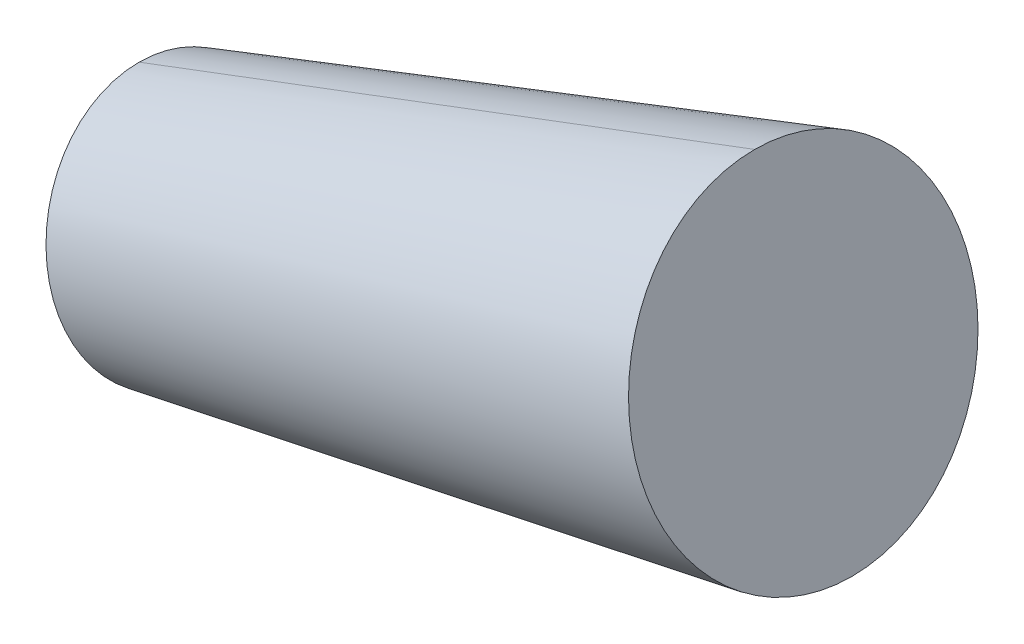
ISO-10303-21;
HEADER;
FILE_DESCRIPTION(('STEP AP214'),'2;1');
FILE_NAME('part.step','',(''),(''),'','','');
FILE_SCHEMA(('AUTOMOTIVE_DESIGN { 1 0 10303 214 1 1 1 1 }'));
ENDSEC;
DATA;
#1=APPLICATION_CONTEXT('core data for automotive mechanical design processes');
#2=APPLICATION_PROTOCOL_DEFINITION('international standard','automotive_design',2000,#1);
#3=PRODUCT_CONTEXT('',#1,'mechanical');
#4=PRODUCT('Part','Part','',(#3));
#5=PRODUCT_RELATED_PRODUCT_CATEGORY('part','',(#4));
#6=PRODUCT_DEFINITION_FORMATION('','',#4);
#7=PRODUCT_DEFINITION_CONTEXT('part definition',#1,'design');
#8=PRODUCT_DEFINITION('design','',#6,#7);
#9=PRODUCT_DEFINITION_SHAPE('','',#8);
#10=(LENGTH_UNIT() NAMED_UNIT(*) SI_UNIT(.MILLI.,.METRE.));
#11=(NAMED_UNIT(*) PLANE_ANGLE_UNIT() SI_UNIT($,.RADIAN.));
#12=(NAMED_UNIT(*) SI_UNIT($,.STERADIAN.) SOLID_ANGLE_UNIT());
#13=UNCERTAINTY_MEASURE_WITH_UNIT(LENGTH_MEASURE(1.E-05),#10,'distance_accuracy_value','');
#14=(GEOMETRIC_REPRESENTATION_CONTEXT(3) GLOBAL_UNCERTAINTY_ASSIGNED_CONTEXT((#13)) GLOBAL_UNIT_ASSIGNED_CONTEXT((#10,
#11,#12)) REPRESENTATION_CONTEXT('',''));
#15=CARTESIAN_POINT('',(0.,0.,0.));
#16=DIRECTION('',(0.,0.,1.));
#17=DIRECTION('',(1.,0.,0.));
#18=AXIS2_PLACEMENT_3D('',#15,#16,#17);
#19=CARTESIAN_POINT('',(13.8143463673463,26.1742486277882,0.));
#20=DIRECTION('',(0.957152868391763,0.289583125422429,0.));
#21=DIRECTION('',(0.,0.,-1.00000000000001));
#22=AXIS2_PLACEMENT_3D('',#19,#20,#21);
#23=CONICAL_SURFACE('',#22,3.375,0.0668984702);
#24=CARTESIAN_POINT('',(1.1799285045748,22.3517513722121,0.));
#25=DIRECTION('',(-0.957152868391762,-0.289583125422429,0.));
#26=DIRECTION('',(0.289583125422428,-0.957152868391767,0.));
#27=AXIS2_PLACEMENT_3D('',#24,#25,#26);
#28=CIRCLE('',#27,2.4906204802);
#29=CARTESIAN_POINT('',(1.9011701674844,19.9678468354731,0.));
#30=VERTEX_POINT('',#29);
#31=CARTESIAN_POINT('',(0.458686841527417,24.7356559093083,0.));
#32=VERTEX_POINT('',#31);
#33=EDGE_CURVE('E13',#30,#32,#28,.T.);
#34=ORIENTED_EDGE('',*,*,#33,.F.);
#35=DIRECTION('',(0.974370064778719,0.22495105437209,0.));
#36=VECTOR('',#35,1.);
#37=CARTESIAN_POINT('',(1.90117016756777,19.9678468350994,0.));
#38=LINE('',#37,#36);
#39=CARTESIAN_POINT('',(14.791689415647,22.9438576969661,0.));
#40=VERTEX_POINT('',#39);
#41=EDGE_CURVE('E33',#30,#40,#38,.T.);
#42=ORIENTED_EDGE('',*,*,#41,.T.);
#43=CARTESIAN_POINT('',(13.8143463673463,26.1742486277882,0.));
#44=DIRECTION('',(-0.957152868391763,-0.289583125422429,0.));
#45=DIRECTION('',(0.289583125422428,-0.957152868391766,0.));
#46=AXIS2_PLACEMENT_3D('',#43,#44,#45);
#47=CIRCLE('',#46,3.375);
#48=CARTESIAN_POINT('',(12.8370033190456,29.4046395586104,0.));
#49=VERTEX_POINT('',#48);
#50=EDGE_CURVE('E50',#40,#49,#47,.T.);
#51=ORIENTED_EDGE('',*,*,#50,.T.);
#52=DIRECTION('',(0.935653622319991,0.352919677886458,0.));
#53=VECTOR('',#52,1.);
#54=CARTESIAN_POINT('',(0.458686841527417,24.7356559093083,0.));
#55=LINE('',#54,#53);
#56=EDGE_CURVE('E47',#32,#49,#55,.T.);
#57=ORIENTED_EDGE('',*,*,#56,.F.);
#58=EDGE_LOOP('',(#34,#42,#51,#57));
#59=FACE_BOUND('',#58,.T.);
#60=ADVANCED_FACE('F25',(#59),#23,.T.);
#61=CARTESIAN_POINT('',(13.8143463673463,26.1742486277882,0.));
#62=DIRECTION('',(0.957152868391763,0.289583125422429,0.));
#63=DIRECTION('',(0.,0.,1.));
#64=AXIS2_PLACEMENT_3D('',#61,#62,#63);
#65=CONICAL_SURFACE('',#64,3.375,0.0668984702);
#66=CARTESIAN_POINT('',(13.8143463673463,26.1742486277882,0.));
#67=DIRECTION('',(-0.957152868391763,-0.289583125422429,0.));
#68=DIRECTION('',(0.289583125422428,-0.957152868391766,0.));
#69=AXIS2_PLACEMENT_3D('',#66,#67,#68);
#70=CIRCLE('',#69,3.375);
#71=EDGE_CURVE('E53',#49,#40,#70,.T.);
#72=ORIENTED_EDGE('',*,*,#71,.T.);
#73=ORIENTED_EDGE('',*,*,#41,.F.);
#74=CARTESIAN_POINT('',(1.1799285045748,22.3517513722121,0.));
#75=DIRECTION('',(-0.957152868391762,-0.289583125422429,0.));
#76=DIRECTION('',(0.289583125422428,-0.957152868391767,0.));
#77=AXIS2_PLACEMENT_3D('',#74,#75,#76);
#78=CIRCLE('',#77,2.4906204802);
#79=EDGE_CURVE('E56',#32,#30,#78,.T.);
#80=ORIENTED_EDGE('',*,*,#79,.F.);
#81=ORIENTED_EDGE('',*,*,#56,.T.);
#82=EDGE_LOOP('',(#72,#73,#80,#81));
#83=FACE_BOUND('',#82,.T.);
#84=ADVANCED_FACE('F57',(#83),#65,.T.);
#85=CARTESIAN_POINT('',(1.90117016748445,19.9678468354731,0.));
#86=DIRECTION('',(0.957152868391762,0.289583125422429,0.));
#87=DIRECTION('',(-0.289583125422428,0.957152868391767,0.));
#88=AXIS2_PLACEMENT_3D('',#85,#86,#87);
#89=PLANE('',#88);
#90=ORIENTED_EDGE('',*,*,#33,.T.);
#91=ORIENTED_EDGE('',*,*,#79,.T.);
#92=EDGE_LOOP('',(#90,#91));
#93=FACE_BOUND('',#92,.T.);
#94=ADVANCED_FACE('F60',(#93),#89,.F.);
#95=CARTESIAN_POINT('',(13.8143463673462,26.1742486277882,0.));
#96=DIRECTION('',(-0.957152868391762,-0.289583125422429,0.));
#97=DIRECTION('',(0.289583125422428,-0.957152868391767,0.));
#98=AXIS2_PLACEMENT_3D('',#95,#96,#97);
#99=PLANE('',#98);
#100=ORIENTED_EDGE('',*,*,#50,.F.);
#101=ORIENTED_EDGE('',*,*,#71,.F.);
#102=EDGE_LOOP('',(#100,#101));
#103=FACE_BOUND('',#102,.T.);
#104=ADVANCED_FACE('F62',(#103),#99,.F.);
#105=CLOSED_SHELL('',(#60,#84,#94,#104));
#106=MANIFOLD_SOLID_BREP('B1',#105);
#107=ADVANCED_BREP_SHAPE_REPRESENTATION('',(#18,#106),#14);
#108=SHAPE_DEFINITION_REPRESENTATION(#9,#107);
ENDSEC;
END-ISO-10303-21;
